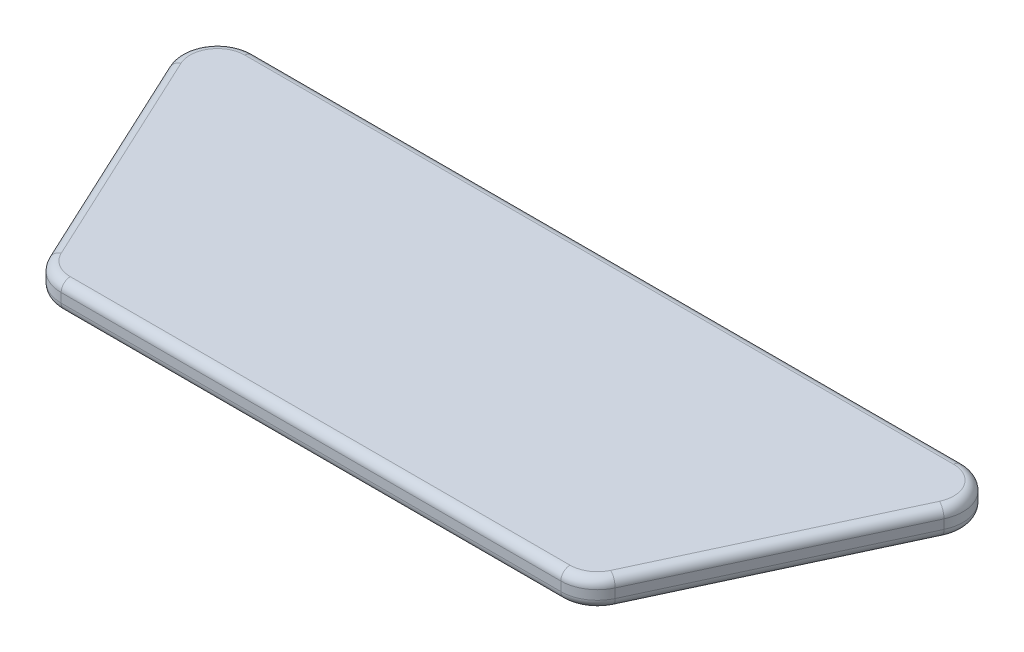
ISO-10303-21;
HEADER;
FILE_DESCRIPTION(('STEP AP214'),'2;1');
FILE_NAME('part.step','',(''),(''),'','','');
FILE_SCHEMA(('AUTOMOTIVE_DESIGN { 1 0 10303 214 1 1 1 1 }'));
ENDSEC;
DATA;
#1=APPLICATION_CONTEXT('core data for automotive mechanical design processes');
#2=APPLICATION_PROTOCOL_DEFINITION('international standard','automotive_design',2000,#1);
#3=PRODUCT_CONTEXT('',#1,'mechanical');
#4=PRODUCT('Part','Part','',(#3));
#5=PRODUCT_RELATED_PRODUCT_CATEGORY('part','',(#4));
#6=PRODUCT_DEFINITION_FORMATION('','',#4);
#7=PRODUCT_DEFINITION_CONTEXT('part definition',#1,'design');
#8=PRODUCT_DEFINITION('design','',#6,#7);
#9=PRODUCT_DEFINITION_SHAPE('','',#8);
#10=(LENGTH_UNIT() NAMED_UNIT(*) SI_UNIT(.MILLI.,.METRE.));
#11=(NAMED_UNIT(*) PLANE_ANGLE_UNIT() SI_UNIT($,.RADIAN.));
#12=(NAMED_UNIT(*) SI_UNIT($,.STERADIAN.) SOLID_ANGLE_UNIT());
#13=UNCERTAINTY_MEASURE_WITH_UNIT(LENGTH_MEASURE(1.E-05),#10,'distance_accuracy_value','');
#14=(GEOMETRIC_REPRESENTATION_CONTEXT(3) GLOBAL_UNCERTAINTY_ASSIGNED_CONTEXT((#13)) GLOBAL_UNIT_ASSIGNED_CONTEXT((#10,
#11,#12)) REPRESENTATION_CONTEXT('',''));
#15=CARTESIAN_POINT('',(0.,0.,0.));
#16=DIRECTION('',(0.,0.,1.));
#17=DIRECTION('',(1.,0.,0.));
#18=AXIS2_PLACEMENT_3D('',#15,#16,#17);
#19=CARTESIAN_POINT('',(261.827991804729,9.525,-4.12755971392547));
#20=DIRECTION('',(0.,-1.,0.));
#21=DIRECTION('',(0.,0.,-1.));
#22=AXIS2_PLACEMENT_3D('',#19,#20,#21);
#23=CYLINDRICAL_SURFACE('',#22,15.24);
#24=DIRECTION('',(0.,-1.,0.));
#25=VECTOR('',#24,1.);
#26=CARTESIAN_POINT('',(275.640122479168,9.525,2.31314259500275));
#27=LINE('',#26,#25);
#28=CARTESIAN_POINT('',(275.640122479168,5.715,2.31314259500275));
#29=VERTEX_POINT('',#28);
#30=CARTESIAN_POINT('',(275.640122479168,1.905,2.31314259500275));
#31=VERTEX_POINT('',#30);
#32=EDGE_CURVE('E240',#29,#31,#27,.T.);
#33=ORIENTED_EDGE('',*,*,#32,.T.);
#34=CARTESIAN_POINT('',(261.827991804729,1.905,-4.12755971392547));
#35=DIRECTION('',(0.,-1.,0.));
#36=DIRECTION('',(0.,0.,-1.));
#37=AXIS2_PLACEMENT_3D('',#34,#35,#36);
#38=CIRCLE('',#37,15.24);
#39=CARTESIAN_POINT('',(261.827991804729,1.905,-19.3675597139255));
#40=VERTEX_POINT('',#39);
#41=EDGE_CURVE('E296',#31,#40,#38,.F.);
#42=ORIENTED_EDGE('',*,*,#41,.T.);
#43=DIRECTION('',(0.,-1.,0.));
#44=VECTOR('',#43,1.);
#45=CARTESIAN_POINT('',(261.827991804729,9.525,-19.3675597139255));
#46=LINE('',#45,#44);
#47=CARTESIAN_POINT('',(261.827991804729,5.715,-19.3675597139255));
#48=VERTEX_POINT('',#47);
#49=EDGE_CURVE('E182',#48,#40,#46,.T.);
#50=ORIENTED_EDGE('',*,*,#49,.F.);
#51=CARTESIAN_POINT('',(261.827991804729,5.715,-4.12755971392547));
#52=DIRECTION('',(0.,-1.,0.));
#53=DIRECTION('',(0.,0.,-1.));
#54=AXIS2_PLACEMENT_3D('',#51,#52,#53);
#55=CIRCLE('',#54,15.24);
#56=EDGE_CURVE('E294',#48,#29,#55,.T.);
#57=ORIENTED_EDGE('',*,*,#56,.T.);
#58=EDGE_LOOP('',(#33,#42,#50,#57));
#59=FACE_BOUND('',#58,.T.);
#60=ADVANCED_FACE('F37',(#59),#23,.T.);
#61=CARTESIAN_POINT('',(-33.2279918047295,9.525,-19.3675597139255));
#62=DIRECTION('',(0.,0.,1.));
#63=DIRECTION('',(1.,0.,0.));
#64=AXIS2_PLACEMENT_3D('',#61,#62,#63);
#65=PLANE('',#64);
#66=ORIENTED_EDGE('',*,*,#49,.T.);
#67=DIRECTION('',(-1.,0.,0.));
#68=VECTOR('',#67,1.);
#69=CARTESIAN_POINT('',(-33.2279918047295,1.905,-19.3675597139255));
#70=LINE('',#69,#68);
#71=CARTESIAN_POINT('',(-33.2279918047295,1.905,-19.3675597139255));
#72=VERTEX_POINT('',#71);
#73=EDGE_CURVE('E292',#40,#72,#70,.T.);
#74=ORIENTED_EDGE('',*,*,#73,.T.);
#75=DIRECTION('',(0.,-1.,0.));
#76=VECTOR('',#75,1.);
#77=CARTESIAN_POINT('',(-33.2279918047295,9.525,-19.3675597139255));
#78=LINE('',#77,#76);
#79=CARTESIAN_POINT('',(-33.2279918047295,5.715,-19.3675597139255));
#80=VERTEX_POINT('',#79);
#81=EDGE_CURVE('E259',#80,#72,#78,.T.);
#82=ORIENTED_EDGE('',*,*,#81,.F.);
#83=DIRECTION('',(-1.,0.,0.));
#84=VECTOR('',#83,1.);
#85=CARTESIAN_POINT('',(-33.2279918047295,5.715,-19.3675597139255));
#86=LINE('',#85,#84);
#87=EDGE_CURVE('E290',#80,#48,#86,.F.);
#88=ORIENTED_EDGE('',*,*,#87,.T.);
#89=EDGE_LOOP('',(#66,#74,#82,#88));
#90=FACE_BOUND('',#89,.T.);
#91=ADVANCED_FACE('F363',(#90),#65,.F.);
#92=CARTESIAN_POINT('',(-33.2279918047295,9.525,-4.12755971392547));
#93=DIRECTION('',(0.,-1.,0.));
#94=DIRECTION('',(0.,0.,-1.));
#95=AXIS2_PLACEMENT_3D('',#92,#93,#94);
#96=CYLINDRICAL_SURFACE('',#95,15.24);
#97=ORIENTED_EDGE('',*,*,#81,.T.);
#98=CARTESIAN_POINT('',(-33.2279918047295,1.905,-4.12755971392547));
#99=DIRECTION('',(0.,-1.,0.));
#100=DIRECTION('',(0.,0.,-1.));
#101=AXIS2_PLACEMENT_3D('',#98,#99,#100);
#102=CIRCLE('',#101,15.24);
#103=CARTESIAN_POINT('',(-47.0401224791681,1.905,2.31314259500276));
#104=VERTEX_POINT('',#103);
#105=EDGE_CURVE('E288',#72,#104,#102,.F.);
#106=ORIENTED_EDGE('',*,*,#105,.T.);
#107=DIRECTION('',(0.,-1.,0.));
#108=VECTOR('',#107,1.);
#109=CARTESIAN_POINT('',(-47.0401224791681,9.525,2.31314259500276));
#110=LINE('',#109,#108);
#111=CARTESIAN_POINT('',(-47.0401224791681,5.715,2.31314259500276));
#112=VERTEX_POINT('',#111);
#113=EDGE_CURVE('E256',#112,#104,#110,.T.);
#114=ORIENTED_EDGE('',*,*,#113,.F.);
#115=CARTESIAN_POINT('',(-33.2279918047295,5.715,-4.12755971392547));
#116=DIRECTION('',(0.,-1.,0.));
#117=DIRECTION('',(0.,0.,-1.));
#118=AXIS2_PLACEMENT_3D('',#115,#116,#117);
#119=CIRCLE('',#118,15.24);
#120=EDGE_CURVE('E286',#112,#80,#119,.T.);
#121=ORIENTED_EDGE('',*,*,#120,.T.);
#122=EDGE_LOOP('',(#97,#106,#114,#121));
#123=FACE_BOUND('',#122,.T.);
#124=ADVANCED_FACE('F339',(#123),#96,.T.);
#125=CARTESIAN_POINT('',(-3.51263412869002,9.525,95.6581425950028));
#126=DIRECTION('',(0.906307787036651,0.,-0.422618261740697));
#127=DIRECTION('',(-0.422618261740697,0.,-0.906307787036651));
#128=AXIS2_PLACEMENT_3D('',#125,#126,#127);
#129=PLANE('',#128);
#130=ORIENTED_EDGE('',*,*,#113,.T.);
#131=DIRECTION('',(0.422618261740697,0.,0.906307787036651));
#132=VECTOR('',#131,1.);
#133=CARTESIAN_POINT('',(-3.51263412869002,1.905,95.6581425950028));
#134=LINE('',#133,#132);
#135=CARTESIAN_POINT('',(-3.51263412869002,1.905,95.6581425950028));
#136=VERTEX_POINT('',#135);
#137=EDGE_CURVE('E284',#104,#136,#134,.T.);
#138=ORIENTED_EDGE('',*,*,#137,.T.);
#139=DIRECTION('',(0.,-1.,0.));
#140=VECTOR('',#139,1.);
#141=CARTESIAN_POINT('',(-3.51263412869002,9.525,95.6581425950028));
#142=LINE('',#141,#140);
#143=CARTESIAN_POINT('',(-3.51263412869002,5.715,95.6581425950028));
#144=VERTEX_POINT('',#143);
#145=EDGE_CURVE('E173',#144,#136,#142,.T.);
#146=ORIENTED_EDGE('',*,*,#145,.F.);
#147=DIRECTION('',(0.422618261740697,0.,0.906307787036651));
#148=VECTOR('',#147,1.);
#149=CARTESIAN_POINT('',(-3.51263412869002,5.715,95.6581425950028));
#150=LINE('',#149,#148);
#151=EDGE_CURVE('E282',#144,#112,#150,.F.);
#152=ORIENTED_EDGE('',*,*,#151,.T.);
#153=EDGE_LOOP('',(#130,#138,#146,#152));
#154=FACE_BOUND('',#153,.T.);
#155=ADVANCED_FACE('F336',(#154),#129,.F.);
#156=CARTESIAN_POINT('',(10.2994965457486,9.525,89.2174402860745));
#157=DIRECTION('',(0.,-1.,0.));
#158=DIRECTION('',(0.,0.,-1.));
#159=AXIS2_PLACEMENT_3D('',#156,#157,#158);
#160=CYLINDRICAL_SURFACE('',#159,15.24);
#161=ORIENTED_EDGE('',*,*,#145,.T.);
#162=CARTESIAN_POINT('',(10.2994965457486,1.905,89.2174402860745));
#163=DIRECTION('',(0.,-1.,0.));
#164=DIRECTION('',(0.,0.,-1.));
#165=AXIS2_PLACEMENT_3D('',#162,#163,#164);
#166=CIRCLE('',#165,15.24);
#167=CARTESIAN_POINT('',(10.2994965457486,1.905,104.457440286075));
#168=VERTEX_POINT('',#167);
#169=EDGE_CURVE('E172',#136,#168,#166,.F.);
#170=ORIENTED_EDGE('',*,*,#169,.T.);
#171=DIRECTION('',(0.,-1.,0.));
#172=VECTOR('',#171,1.);
#173=CARTESIAN_POINT('',(10.2994965457486,9.525,104.457440286075));
#174=LINE('',#173,#172);
#175=CARTESIAN_POINT('',(10.2994965457486,5.715,104.457440286075));
#176=VERTEX_POINT('',#175);
#177=EDGE_CURVE('E154',#176,#168,#174,.T.);
#178=ORIENTED_EDGE('',*,*,#177,.F.);
#179=CARTESIAN_POINT('',(10.2994965457486,5.715,89.2174402860745));
#180=DIRECTION('',(0.,-1.,0.));
#181=DIRECTION('',(0.,0.,-1.));
#182=AXIS2_PLACEMENT_3D('',#179,#180,#181);
#183=CIRCLE('',#182,15.24);
#184=EDGE_CURVE('E169',#176,#144,#183,.T.);
#185=ORIENTED_EDGE('',*,*,#184,.T.);
#186=EDGE_LOOP('',(#161,#170,#178,#185));
#187=FACE_BOUND('',#186,.T.);
#188=ADVANCED_FACE('F168',(#187),#160,.T.);
#189=CARTESIAN_POINT('',(218.300503454251,9.525,104.457440286074));
#190=DIRECTION('',(0.,0.,-1.));
#191=DIRECTION('',(-1.,0.,0.));
#192=AXIS2_PLACEMENT_3D('',#189,#190,#191);
#193=PLANE('',#192);
#194=ORIENTED_EDGE('',*,*,#177,.T.);
#195=DIRECTION('',(1.,0.,0.));
#196=VECTOR('',#195,1.);
#197=CARTESIAN_POINT('',(218.300503454251,1.905,104.457440286074));
#198=LINE('',#197,#196);
#199=CARTESIAN_POINT('',(218.300503454251,1.905,104.457440286074));
#200=VERTEX_POINT('',#199);
#201=EDGE_CURVE('E11',#168,#200,#198,.T.);
#202=ORIENTED_EDGE('',*,*,#201,.T.);
#203=DIRECTION('',(0.,-1.,0.));
#204=VECTOR('',#203,1.);
#205=CARTESIAN_POINT('',(218.300503454251,9.525,104.457440286074));
#206=LINE('',#205,#204);
#207=CARTESIAN_POINT('',(218.300503454251,5.715,104.457440286074));
#208=VERTEX_POINT('',#207);
#209=EDGE_CURVE('E156',#208,#200,#206,.T.);
#210=ORIENTED_EDGE('',*,*,#209,.F.);
#211=DIRECTION('',(1.,0.,0.));
#212=VECTOR('',#211,1.);
#213=CARTESIAN_POINT('',(218.300503454251,5.715,104.457440286074));
#214=LINE('',#213,#212);
#215=EDGE_CURVE('E46',#208,#176,#214,.F.);
#216=ORIENTED_EDGE('',*,*,#215,.T.);
#217=EDGE_LOOP('',(#194,#202,#210,#216));
#218=FACE_BOUND('',#217,.T.);
#219=ADVANCED_FACE('F153',(#218),#193,.F.);
#220=CARTESIAN_POINT('',(218.300503454251,9.525,89.2174402860745));
#221=DIRECTION('',(0.,-1.,0.));
#222=DIRECTION('',(0.,0.,-1.));
#223=AXIS2_PLACEMENT_3D('',#220,#221,#222);
#224=CYLINDRICAL_SURFACE('',#223,15.24);
#225=ORIENTED_EDGE('',*,*,#209,.T.);
#226=CARTESIAN_POINT('',(218.300503454251,1.905,89.2174402860745));
#227=DIRECTION('',(0.,-1.,0.));
#228=DIRECTION('',(0.,0.,-1.));
#229=AXIS2_PLACEMENT_3D('',#226,#227,#228);
#230=CIRCLE('',#229,15.24);
#231=CARTESIAN_POINT('',(232.11263412869,1.905,95.6581425950027));
#232=VERTEX_POINT('',#231);
#233=EDGE_CURVE('E304',#200,#232,#230,.F.);
#234=ORIENTED_EDGE('',*,*,#233,.T.);
#235=DIRECTION('',(0.,-1.,0.));
#236=VECTOR('',#235,1.);
#237=CARTESIAN_POINT('',(232.11263412869,9.525,95.6581425950027));
#238=LINE('',#237,#236);
#239=CARTESIAN_POINT('',(232.11263412869,5.715,95.6581425950027));
#240=VERTEX_POINT('',#239);
#241=EDGE_CURVE('E246',#240,#232,#238,.T.);
#242=ORIENTED_EDGE('',*,*,#241,.F.);
#243=CARTESIAN_POINT('',(218.300503454251,5.715,89.2174402860745));
#244=DIRECTION('',(0.,-1.,0.));
#245=DIRECTION('',(0.,0.,-1.));
#246=AXIS2_PLACEMENT_3D('',#243,#244,#245);
#247=CIRCLE('',#246,15.24);
#248=EDGE_CURVE('E302',#240,#208,#247,.T.);
#249=ORIENTED_EDGE('',*,*,#248,.T.);
#250=EDGE_LOOP('',(#225,#234,#242,#249));
#251=FACE_BOUND('',#250,.T.);
#252=ADVANCED_FACE('F378',(#251),#224,.T.);
#253=CARTESIAN_POINT('',(275.640122479168,9.525,2.31314259500275));
#254=DIRECTION('',(-0.906307787036651,0.,-0.422618261740697));
#255=DIRECTION('',(-0.422618261740697,0.,0.906307787036651));
#256=AXIS2_PLACEMENT_3D('',#253,#254,#255);
#257=PLANE('',#256);
#258=ORIENTED_EDGE('',*,*,#241,.T.);
#259=DIRECTION('',(0.422618261740697,0.,-0.906307787036651));
#260=VECTOR('',#259,1.);
#261=CARTESIAN_POINT('',(275.640122479168,1.905,2.31314259500275));
#262=LINE('',#261,#260);
#263=EDGE_CURVE('E300',#232,#31,#262,.T.);
#264=ORIENTED_EDGE('',*,*,#263,.T.);
#265=ORIENTED_EDGE('',*,*,#32,.F.);
#266=DIRECTION('',(0.422618261740697,0.,-0.906307787036651));
#267=VECTOR('',#266,1.);
#268=CARTESIAN_POINT('',(275.640122479168,5.715,2.31314259500275));
#269=LINE('',#268,#267);
#270=EDGE_CURVE('E298',#29,#240,#269,.F.);
#271=ORIENTED_EDGE('',*,*,#270,.T.);
#272=EDGE_LOOP('',(#258,#264,#265,#271));
#273=FACE_BOUND('',#272,.T.);
#274=ADVANCED_FACE('F381',(#273),#257,.F.);
#275=CARTESIAN_POINT('',(261.827991804729,9.525,-4.12755971392547));
#276=DIRECTION('',(0.,-1.,0.));
#277=DIRECTION('',(0.,0.,-1.));
#278=AXIS2_PLACEMENT_3D('',#275,#276,#277);
#279=PLANE('',#278);
#280=DIRECTION('',(0.422618261740697,0.,0.906307787036651));
#281=VECTOR('',#280,1.);
#282=CARTESIAN_POINT('',(9.11173678015309,9.525,113.715965344285));
#283=LINE('',#282,#281);
#284=CARTESIAN_POINT('',(-43.5870898105584,9.525,0.702967017770699));
#285=VERTEX_POINT('',#284);
#286=CARTESIAN_POINT('',(-0.0596014600803378,9.525,94.0479670177707));
#287=VERTEX_POINT('',#286);
#288=EDGE_CURVE('E54',#285,#287,#283,.T.);
#289=ORIENTED_EDGE('',*,*,#288,.T.);
#290=CARTESIAN_POINT('',(10.2994965457486,9.525,89.2174402860745));
#291=DIRECTION('',(0.,-1.,0.));
#292=DIRECTION('',(0.,0.,-1.));
#293=AXIS2_PLACEMENT_3D('',#290,#291,#292);
#294=CIRCLE('',#293,11.43);
#295=CARTESIAN_POINT('',(10.2994965457486,9.525,100.647440286075));
#296=VERTEX_POINT('',#295);
#297=EDGE_CURVE('E161',#287,#296,#294,.F.);
#298=ORIENTED_EDGE('',*,*,#297,.T.);
#299=DIRECTION('',(1.,0.,0.));
#300=VECTOR('',#299,1.);
#301=CARTESIAN_POINT('',(261.82799180473,9.525,100.647440286074));
#302=LINE('',#301,#300);
#303=CARTESIAN_POINT('',(218.300503454251,9.525,100.647440286074));
#304=VERTEX_POINT('',#303);
#305=EDGE_CURVE('E185',#296,#304,#302,.T.);
#306=ORIENTED_EDGE('',*,*,#305,.T.);
#307=CARTESIAN_POINT('',(218.300503454251,9.525,89.2174402860745));
#308=DIRECTION('',(0.,-1.,0.));
#309=DIRECTION('',(0.,0.,-1.));
#310=AXIS2_PLACEMENT_3D('',#307,#308,#309);
#311=CIRCLE('',#310,11.43);
#312=CARTESIAN_POINT('',(228.65960146008,9.525,94.0479670177707));
#313=VERTEX_POINT('',#312);
#314=EDGE_CURVE('E307',#304,#313,#311,.F.);
#315=ORIENTED_EDGE('',*,*,#314,.T.);
#316=DIRECTION('',(0.422618261740697,0.,-0.906307787036651));
#317=VECTOR('',#316,1.);
#318=CARTESIAN_POINT('',(272.187089810558,9.525,0.702967017770681));
#319=LINE('',#318,#317);
#320=CARTESIAN_POINT('',(272.187089810558,9.525,0.702967017770689));
#321=VERTEX_POINT('',#320);
#322=EDGE_CURVE('E309',#313,#321,#319,.T.);
#323=ORIENTED_EDGE('',*,*,#322,.T.);
#324=CARTESIAN_POINT('',(261.827991804729,9.525,-4.12755971392547));
#325=DIRECTION('',(0.,-1.,0.));
#326=DIRECTION('',(0.,0.,-1.));
#327=AXIS2_PLACEMENT_3D('',#324,#325,#326);
#328=CIRCLE('',#327,11.43);
#329=CARTESIAN_POINT('',(261.827991804729,9.525,-15.5575597139254));
#330=VERTEX_POINT('',#329);
#331=EDGE_CURVE('E311',#321,#330,#328,.F.);
#332=ORIENTED_EDGE('',*,*,#331,.T.);
#333=DIRECTION('',(-1.,0.,0.));
#334=VECTOR('',#333,1.);
#335=CARTESIAN_POINT('',(261.827991804729,9.525,-15.5575597139255));
#336=LINE('',#335,#334);
#337=CARTESIAN_POINT('',(-33.2279918047295,9.525,-15.5575597139255));
#338=VERTEX_POINT('',#337);
#339=EDGE_CURVE('E313',#330,#338,#336,.T.);
#340=ORIENTED_EDGE('',*,*,#339,.T.);
#341=CARTESIAN_POINT('',(-33.2279918047295,9.525,-4.12755971392547));
#342=DIRECTION('',(0.,-1.,0.));
#343=DIRECTION('',(0.,0.,-1.));
#344=AXIS2_PLACEMENT_3D('',#341,#342,#343);
#345=CIRCLE('',#344,11.43);
#346=EDGE_CURVE('E59',#338,#285,#345,.F.);
#347=ORIENTED_EDGE('',*,*,#346,.T.);
#348=EDGE_LOOP('',(#289,#298,#306,#315,#323,#332,#340,#347));
#349=FACE_BOUND('',#348,.T.);
#350=ADVANCED_FACE('F317',(#349),#279,.F.);
#351=CARTESIAN_POINT('',(261.827991804729,-1.905,-4.12755971392547));
#352=DIRECTION('',(0.,-1.,0.));
#353=DIRECTION('',(0.,0.,-1.));
#354=AXIS2_PLACEMENT_3D('',#351,#352,#353);
#355=PLANE('',#354);
#356=DIRECTION('',(1.,0.,0.));
#357=VECTOR('',#356,1.);
#358=CARTESIAN_POINT('',(10.2994965457486,-1.905,100.647440286075));
#359=LINE('',#358,#357);
#360=CARTESIAN_POINT('',(218.300503454251,-1.905,100.647440286074));
#361=VERTEX_POINT('',#360);
#362=CARTESIAN_POINT('',(10.2994965457486,-1.905,100.647440286075));
#363=VERTEX_POINT('',#362);
#364=EDGE_CURVE('E265',#361,#363,#359,.F.);
#365=ORIENTED_EDGE('',*,*,#364,.T.);
#366=CARTESIAN_POINT('',(10.2994965457486,-1.905,89.2174402860745));
#367=DIRECTION('',(0.,-1.,0.));
#368=DIRECTION('',(0.,0.,-1.));
#369=AXIS2_PLACEMENT_3D('',#366,#367,#368);
#370=CIRCLE('',#369,11.43);
#371=CARTESIAN_POINT('',(-0.0596014600803794,-1.905,94.0479670177707));
#372=VERTEX_POINT('',#371);
#373=EDGE_CURVE('E279',#363,#372,#370,.T.);
#374=ORIENTED_EDGE('',*,*,#373,.T.);
#375=DIRECTION('',(0.422618261740697,0.,0.906307787036651));
#376=VECTOR('',#375,1.);
#377=CARTESIAN_POINT('',(-43.5870898105584,-1.905,0.702967017770702));
#378=LINE('',#377,#376);
#379=CARTESIAN_POINT('',(-43.5870898105584,-1.905,0.702967017770697));
#380=VERTEX_POINT('',#379);
#381=EDGE_CURVE('E277',#372,#380,#378,.F.);
#382=ORIENTED_EDGE('',*,*,#381,.T.);
#383=CARTESIAN_POINT('',(-33.2279918047295,-1.905,-4.12755971392547));
#384=DIRECTION('',(0.,-1.,0.));
#385=DIRECTION('',(0.,0.,-1.));
#386=AXIS2_PLACEMENT_3D('',#383,#384,#385);
#387=CIRCLE('',#386,11.43);
#388=CARTESIAN_POINT('',(-33.2279918047295,-1.905,-15.5575597139255));
#389=VERTEX_POINT('',#388);
#390=EDGE_CURVE('E275',#380,#389,#387,.T.);
#391=ORIENTED_EDGE('',*,*,#390,.T.);
#392=DIRECTION('',(-1.,0.,0.));
#393=VECTOR('',#392,1.);
#394=CARTESIAN_POINT('',(261.827991804729,-1.905,-15.5575597139255));
#395=LINE('',#394,#393);
#396=CARTESIAN_POINT('',(261.827991804729,-1.905,-15.5575597139254));
#397=VERTEX_POINT('',#396);
#398=EDGE_CURVE('E273',#389,#397,#395,.F.);
#399=ORIENTED_EDGE('',*,*,#398,.T.);
#400=CARTESIAN_POINT('',(261.827991804729,-1.905,-4.12755971392547));
#401=DIRECTION('',(0.,-1.,0.));
#402=DIRECTION('',(0.,0.,-1.));
#403=AXIS2_PLACEMENT_3D('',#400,#401,#402);
#404=CIRCLE('',#403,11.43);
#405=CARTESIAN_POINT('',(272.187089810558,-1.905,0.702967017770684));
#406=VERTEX_POINT('',#405);
#407=EDGE_CURVE('E271',#397,#406,#404,.T.);
#408=ORIENTED_EDGE('',*,*,#407,.T.);
#409=DIRECTION('',(0.422618261740697,0.,-0.906307787036651));
#410=VECTOR('',#409,1.);
#411=CARTESIAN_POINT('',(228.65960146008,-1.905,94.0479670177707));
#412=LINE('',#411,#410);
#413=CARTESIAN_POINT('',(228.65960146008,-1.905,94.0479670177707));
#414=VERTEX_POINT('',#413);
#415=EDGE_CURVE('E269',#406,#414,#412,.F.);
#416=ORIENTED_EDGE('',*,*,#415,.T.);
#417=CARTESIAN_POINT('',(218.300503454251,-1.905,89.2174402860745));
#418=DIRECTION('',(0.,-1.,0.));
#419=DIRECTION('',(0.,0.,-1.));
#420=AXIS2_PLACEMENT_3D('',#417,#418,#419);
#421=CIRCLE('',#420,11.43);
#422=EDGE_CURVE('E267',#414,#361,#421,.T.);
#423=ORIENTED_EDGE('',*,*,#422,.T.);
#424=EDGE_LOOP('',(#365,#374,#382,#391,#399,#408,#416,#423));
#425=FACE_BOUND('',#424,.T.);
#426=ADVANCED_FACE('F386',(#425),#355,.T.);
#427=CARTESIAN_POINT('',(261.827991804729,1.905,-4.12755971392547));
#428=DIRECTION('',(0.,-1.,0.));
#429=DIRECTION('',(0.,0.,-1.));
#430=AXIS2_PLACEMENT_3D('',#427,#428,#429);
#431=TOROIDAL_SURFACE('',#430,11.43,3.81);
#432=CARTESIAN_POINT('',(272.187089810558,1.905,0.702967017770702));
#433=DIRECTION('',(-0.422618261740697,0.,0.906307787036651));
#434=DIRECTION('',(0.906307787036651,0.,0.422618261740697));
#435=AXIS2_PLACEMENT_3D('',#432,#433,#434);
#436=CIRCLE('',#435,3.81);
#437=EDGE_CURVE('E233',#406,#31,#436,.T.);
#438=ORIENTED_EDGE('',*,*,#437,.F.);
#439=ORIENTED_EDGE('',*,*,#407,.F.);
#440=CARTESIAN_POINT('',(261.827991804729,1.905,-15.5575597139254));
#441=DIRECTION('',(-1.,0.,0.));
#442=DIRECTION('',(0.,0.,1.));
#443=AXIS2_PLACEMENT_3D('',#440,#441,#442);
#444=CIRCLE('',#443,3.81);
#445=EDGE_CURVE('E190',#40,#397,#444,.T.);
#446=ORIENTED_EDGE('',*,*,#445,.F.);
#447=ORIENTED_EDGE('',*,*,#41,.F.);
#448=EDGE_LOOP('',(#438,#439,#446,#447));
#449=FACE_BOUND('',#448,.T.);
#450=ADVANCED_FACE('F389',(#449),#431,.T.);
#451=CARTESIAN_POINT('',(-33.2279918047295,1.905,-15.5575597139255));
#452=DIRECTION('',(1.,0.,0.));
#453=DIRECTION('',(0.,0.,-1.));
#454=AXIS2_PLACEMENT_3D('',#451,#452,#453);
#455=CYLINDRICAL_SURFACE('',#454,3.81);
#456=ORIENTED_EDGE('',*,*,#445,.T.);
#457=ORIENTED_EDGE('',*,*,#398,.F.);
#458=CARTESIAN_POINT('',(-33.2279918047295,1.905,-15.5575597139255));
#459=DIRECTION('',(-1.,0.,0.));
#460=DIRECTION('',(0.,0.,1.));
#461=AXIS2_PLACEMENT_3D('',#458,#459,#460);
#462=CIRCLE('',#461,3.81);
#463=EDGE_CURVE('E231',#72,#389,#462,.T.);
#464=ORIENTED_EDGE('',*,*,#463,.F.);
#465=ORIENTED_EDGE('',*,*,#73,.F.);
#466=EDGE_LOOP('',(#456,#457,#464,#465));
#467=FACE_BOUND('',#466,.T.);
#468=ADVANCED_FACE('F406',(#467),#455,.T.);
#469=CARTESIAN_POINT('',(272.187089810558,1.905,0.702967017770694));
#470=DIRECTION('',(-0.422618261740697,0.,0.906307787036651));
#471=DIRECTION('',(0.906307787036651,0.,0.422618261740697));
#472=AXIS2_PLACEMENT_3D('',#469,#470,#471);
#473=CYLINDRICAL_SURFACE('',#472,3.81);
#474=ORIENTED_EDGE('',*,*,#437,.T.);
#475=ORIENTED_EDGE('',*,*,#263,.F.);
#476=CARTESIAN_POINT('',(228.65960146008,1.905,94.0479670177707));
#477=DIRECTION('',(-0.422618261740697,0.,0.906307787036651));
#478=DIRECTION('',(0.906307787036651,0.,0.422618261740697));
#479=AXIS2_PLACEMENT_3D('',#476,#477,#478);
#480=CIRCLE('',#479,3.81);
#481=EDGE_CURVE('E228',#414,#232,#480,.T.);
#482=ORIENTED_EDGE('',*,*,#481,.F.);
#483=ORIENTED_EDGE('',*,*,#415,.F.);
#484=EDGE_LOOP('',(#474,#475,#482,#483));
#485=FACE_BOUND('',#484,.T.);
#486=ADVANCED_FACE('F414',(#485),#473,.T.);
#487=CARTESIAN_POINT('',(-33.2279918047295,1.905,-4.12755971392547));
#488=DIRECTION('',(0.,-1.,0.));
#489=DIRECTION('',(0.,0.,-1.));
#490=AXIS2_PLACEMENT_3D('',#487,#488,#489);
#491=TOROIDAL_SURFACE('',#490,11.43,3.81);
#492=ORIENTED_EDGE('',*,*,#463,.T.);
#493=ORIENTED_EDGE('',*,*,#390,.F.);
#494=CARTESIAN_POINT('',(-43.5870898105584,1.905,0.702967017770699));
#495=DIRECTION('',(0.422618261740697,0.,0.906307787036651));
#496=DIRECTION('',(0.906307787036651,0.,-0.422618261740697));
#497=AXIS2_PLACEMENT_3D('',#494,#495,#496);
#498=CIRCLE('',#497,3.81);
#499=EDGE_CURVE('E225',#104,#380,#498,.T.);
#500=ORIENTED_EDGE('',*,*,#499,.F.);
#501=ORIENTED_EDGE('',*,*,#105,.F.);
#502=EDGE_LOOP('',(#492,#493,#500,#501));
#503=FACE_BOUND('',#502,.T.);
#504=ADVANCED_FACE('F344',(#503),#491,.T.);
#505=CARTESIAN_POINT('',(218.300503454251,1.905,89.2174402860745));
#506=DIRECTION('',(0.,-1.,0.));
#507=DIRECTION('',(0.,0.,-1.));
#508=AXIS2_PLACEMENT_3D('',#505,#506,#507);
#509=TOROIDAL_SURFACE('',#508,11.43,3.81);
#510=ORIENTED_EDGE('',*,*,#481,.T.);
#511=ORIENTED_EDGE('',*,*,#233,.F.);
#512=CARTESIAN_POINT('',(218.300503454251,1.905,100.647440286074));
#513=DIRECTION('',(-1.,0.,0.));
#514=DIRECTION('',(0.,0.,1.));
#515=AXIS2_PLACEMENT_3D('',#512,#513,#514);
#516=CIRCLE('',#515,3.81);
#517=EDGE_CURVE('E220',#361,#200,#516,.T.);
#518=ORIENTED_EDGE('',*,*,#517,.F.);
#519=ORIENTED_EDGE('',*,*,#422,.F.);
#520=EDGE_LOOP('',(#510,#511,#518,#519));
#521=FACE_BOUND('',#520,.T.);
#522=ADVANCED_FACE('F427',(#521),#509,.T.);
#523=CARTESIAN_POINT('',(-0.0596014600803794,1.905,94.0479670177707));
#524=DIRECTION('',(-0.422618261740697,0.,-0.906307787036651));
#525=DIRECTION('',(-0.906307787036651,0.,0.422618261740697));
#526=AXIS2_PLACEMENT_3D('',#523,#524,#525);
#527=CYLINDRICAL_SURFACE('',#526,3.81);
#528=ORIENTED_EDGE('',*,*,#499,.T.);
#529=ORIENTED_EDGE('',*,*,#381,.F.);
#530=CARTESIAN_POINT('',(-0.0596014600803794,1.905,94.0479670177707));
#531=DIRECTION('',(0.422618261740698,0.,0.906307787036651));
#532=DIRECTION('',(0.906307787036651,0.,-0.422618261740698));
#533=AXIS2_PLACEMENT_3D('',#530,#531,#532);
#534=CIRCLE('',#533,3.81);
#535=EDGE_CURVE('E214',#136,#372,#534,.T.);
#536=ORIENTED_EDGE('',*,*,#535,.F.);
#537=ORIENTED_EDGE('',*,*,#137,.F.);
#538=EDGE_LOOP('',(#528,#529,#536,#537));
#539=FACE_BOUND('',#538,.T.);
#540=ADVANCED_FACE('F350',(#539),#527,.T.);
#541=CARTESIAN_POINT('',(218.300503454251,1.905,100.647440286074));
#542=DIRECTION('',(-1.,0.,0.));
#543=DIRECTION('',(0.,0.,1.));
#544=AXIS2_PLACEMENT_3D('',#541,#542,#543);
#545=CYLINDRICAL_SURFACE('',#544,3.81);
#546=ORIENTED_EDGE('',*,*,#517,.T.);
#547=ORIENTED_EDGE('',*,*,#201,.F.);
#548=CARTESIAN_POINT('',(10.2994965457486,1.905,100.647440286075));
#549=DIRECTION('',(-1.,0.,0.));
#550=DIRECTION('',(0.,0.,1.));
#551=AXIS2_PLACEMENT_3D('',#548,#549,#550);
#552=CIRCLE('',#551,3.81);
#553=EDGE_CURVE('E209',#363,#168,#552,.T.);
#554=ORIENTED_EDGE('',*,*,#553,.F.);
#555=ORIENTED_EDGE('',*,*,#364,.F.);
#556=EDGE_LOOP('',(#546,#547,#554,#555));
#557=FACE_BOUND('',#556,.T.);
#558=ADVANCED_FACE('F353',(#557),#545,.T.);
#559=CARTESIAN_POINT('',(10.2994965457486,1.905,89.2174402860745));
#560=DIRECTION('',(0.,-1.,0.));
#561=DIRECTION('',(0.,0.,-1.));
#562=AXIS2_PLACEMENT_3D('',#559,#560,#561);
#563=TOROIDAL_SURFACE('',#562,11.43,3.81);
#564=ORIENTED_EDGE('',*,*,#535,.T.);
#565=ORIENTED_EDGE('',*,*,#373,.F.);
#566=ORIENTED_EDGE('',*,*,#553,.T.);
#567=ORIENTED_EDGE('',*,*,#169,.F.);
#568=EDGE_LOOP('',(#564,#565,#566,#567));
#569=FACE_BOUND('',#568,.T.);
#570=ADVANCED_FACE('F351',(#569),#563,.T.);
#571=CARTESIAN_POINT('',(261.827991804729,5.715,-4.12755971392547));
#572=DIRECTION('',(0.,-1.,0.));
#573=DIRECTION('',(0.,0.,-1.));
#574=AXIS2_PLACEMENT_3D('',#571,#572,#573);
#575=TOROIDAL_SURFACE('',#574,11.43,3.81);
#576=CARTESIAN_POINT('',(272.187089810558,5.715,0.702967017770705));
#577=DIRECTION('',(-0.422618261740696,0.,0.906307787036651));
#578=DIRECTION('',(0.906307787036651,0.,0.422618261740696));
#579=AXIS2_PLACEMENT_3D('',#576,#577,#578);
#580=CIRCLE('',#579,3.81);
#581=EDGE_CURVE('E202',#29,#321,#580,.T.);
#582=ORIENTED_EDGE('',*,*,#581,.F.);
#583=ORIENTED_EDGE('',*,*,#56,.F.);
#584=CARTESIAN_POINT('',(261.827991804729,5.715,-15.5575597139254));
#585=DIRECTION('',(-1.,0.,0.));
#586=DIRECTION('',(0.,0.,1.));
#587=AXIS2_PLACEMENT_3D('',#584,#585,#586);
#588=CIRCLE('',#587,3.81);
#589=EDGE_CURVE('E41',#330,#48,#588,.T.);
#590=ORIENTED_EDGE('',*,*,#589,.F.);
#591=ORIENTED_EDGE('',*,*,#331,.F.);
#592=EDGE_LOOP('',(#582,#583,#590,#591));
#593=FACE_BOUND('',#592,.T.);
#594=ADVANCED_FACE('F39',(#593),#575,.T.);
#595=CARTESIAN_POINT('',(261.827991804729,5.715,-15.5575597139255));
#596=DIRECTION('',(-1.,0.,0.));
#597=DIRECTION('',(0.,0.,1.));
#598=AXIS2_PLACEMENT_3D('',#595,#596,#597);
#599=CYLINDRICAL_SURFACE('',#598,3.81);
#600=ORIENTED_EDGE('',*,*,#589,.T.);
#601=ORIENTED_EDGE('',*,*,#87,.F.);
#602=CARTESIAN_POINT('',(-33.2279918047295,5.715,-15.5575597139255));
#603=DIRECTION('',(-1.,0.,0.));
#604=DIRECTION('',(0.,0.,1.));
#605=AXIS2_PLACEMENT_3D('',#602,#603,#604);
#606=CIRCLE('',#605,3.81);
#607=EDGE_CURVE('E200',#338,#80,#606,.T.);
#608=ORIENTED_EDGE('',*,*,#607,.F.);
#609=ORIENTED_EDGE('',*,*,#339,.F.);
#610=EDGE_LOOP('',(#600,#601,#608,#609));
#611=FACE_BOUND('',#610,.T.);
#612=ADVANCED_FACE('F328',(#611),#599,.T.);
#613=CARTESIAN_POINT('',(272.187089810558,5.715,0.702967017770681));
#614=DIRECTION('',(0.422618261740697,0.,-0.906307787036651));
#615=DIRECTION('',(-0.906307787036651,0.,-0.422618261740697));
#616=AXIS2_PLACEMENT_3D('',#613,#614,#615);
#617=CYLINDRICAL_SURFACE('',#616,3.81);
#618=ORIENTED_EDGE('',*,*,#581,.T.);
#619=ORIENTED_EDGE('',*,*,#322,.F.);
#620=CARTESIAN_POINT('',(228.65960146008,5.715,94.0479670177707));
#621=DIRECTION('',(-0.422618261740697,0.,0.906307787036651));
#622=DIRECTION('',(0.906307787036651,0.,0.422618261740697));
#623=AXIS2_PLACEMENT_3D('',#620,#621,#622);
#624=CIRCLE('',#623,3.81);
#625=EDGE_CURVE('E197',#240,#313,#624,.T.);
#626=ORIENTED_EDGE('',*,*,#625,.F.);
#627=ORIENTED_EDGE('',*,*,#270,.F.);
#628=EDGE_LOOP('',(#618,#619,#626,#627));
#629=FACE_BOUND('',#628,.T.);
#630=ADVANCED_FACE('F323',(#629),#617,.T.);
#631=CARTESIAN_POINT('',(-33.2279918047295,5.715,-4.12755971392547));
#632=DIRECTION('',(0.,-1.,0.));
#633=DIRECTION('',(0.,0.,-1.));
#634=AXIS2_PLACEMENT_3D('',#631,#632,#633);
#635=TOROIDAL_SURFACE('',#634,11.43,3.81);
#636=ORIENTED_EDGE('',*,*,#607,.T.);
#637=ORIENTED_EDGE('',*,*,#120,.F.);
#638=CARTESIAN_POINT('',(-43.5870898105584,5.715,0.702967017770699));
#639=DIRECTION('',(0.422618261740697,0.,0.906307787036651));
#640=DIRECTION('',(0.906307787036651,0.,-0.422618261740697));
#641=AXIS2_PLACEMENT_3D('',#638,#639,#640);
#642=CIRCLE('',#641,3.81);
#643=EDGE_CURVE('E194',#285,#112,#642,.T.);
#644=ORIENTED_EDGE('',*,*,#643,.F.);
#645=ORIENTED_EDGE('',*,*,#346,.F.);
#646=EDGE_LOOP('',(#636,#637,#644,#645));
#647=FACE_BOUND('',#646,.T.);
#648=ADVANCED_FACE('F331',(#647),#635,.T.);
#649=CARTESIAN_POINT('',(218.300503454251,5.715,89.2174402860745));
#650=DIRECTION('',(0.,-1.,0.));
#651=DIRECTION('',(0.,0.,-1.));
#652=AXIS2_PLACEMENT_3D('',#649,#650,#651);
#653=TOROIDAL_SURFACE('',#652,11.43,3.81);
#654=ORIENTED_EDGE('',*,*,#625,.T.);
#655=ORIENTED_EDGE('',*,*,#314,.F.);
#656=CARTESIAN_POINT('',(218.300503454251,5.715,100.647440286074));
#657=DIRECTION('',(-1.,0.,0.));
#658=DIRECTION('',(0.,0.,1.));
#659=AXIS2_PLACEMENT_3D('',#656,#657,#658);
#660=CIRCLE('',#659,3.81);
#661=EDGE_CURVE('E187',#208,#304,#660,.T.);
#662=ORIENTED_EDGE('',*,*,#661,.F.);
#663=ORIENTED_EDGE('',*,*,#248,.F.);
#664=EDGE_LOOP('',(#654,#655,#662,#663));
#665=FACE_BOUND('',#664,.T.);
#666=ADVANCED_FACE('F320',(#665),#653,.T.);
#667=CARTESIAN_POINT('',(9.11173678015309,5.715,113.715965344285));
#668=DIRECTION('',(0.422618261740697,0.,0.906307787036651));
#669=DIRECTION('',(0.906307787036651,0.,-0.422618261740697));
#670=AXIS2_PLACEMENT_3D('',#667,#668,#669);
#671=CYLINDRICAL_SURFACE('',#670,3.81);
#672=ORIENTED_EDGE('',*,*,#643,.T.);
#673=ORIENTED_EDGE('',*,*,#151,.F.);
#674=CARTESIAN_POINT('',(-0.0596014600803378,5.715,94.0479670177707));
#675=DIRECTION('',(0.422618261740698,0.,0.90630778703665));
#676=DIRECTION('',(0.90630778703665,0.,-0.422618261740698));
#677=AXIS2_PLACEMENT_3D('',#674,#675,#676);
#678=CIRCLE('',#677,3.81);
#679=EDGE_CURVE('E180',#287,#144,#678,.T.);
#680=ORIENTED_EDGE('',*,*,#679,.F.);
#681=ORIENTED_EDGE('',*,*,#288,.F.);
#682=EDGE_LOOP('',(#672,#673,#680,#681));
#683=FACE_BOUND('',#682,.T.);
#684=ADVANCED_FACE('F333',(#683),#671,.T.);
#685=CARTESIAN_POINT('',(261.82799180473,5.715,100.647440286074));
#686=DIRECTION('',(1.,0.,0.));
#687=DIRECTION('',(0.,0.,-1.));
#688=AXIS2_PLACEMENT_3D('',#685,#686,#687);
#689=CYLINDRICAL_SURFACE('',#688,3.81);
#690=ORIENTED_EDGE('',*,*,#661,.T.);
#691=ORIENTED_EDGE('',*,*,#305,.F.);
#692=CARTESIAN_POINT('',(10.2994965457486,5.715,100.647440286075));
#693=DIRECTION('',(-1.,0.,0.));
#694=DIRECTION('',(0.,0.,1.));
#695=AXIS2_PLACEMENT_3D('',#692,#693,#694);
#696=CIRCLE('',#695,3.81);
#697=EDGE_CURVE('E178',#176,#296,#696,.T.);
#698=ORIENTED_EDGE('',*,*,#697,.F.);
#699=ORIENTED_EDGE('',*,*,#215,.F.);
#700=EDGE_LOOP('',(#690,#691,#698,#699));
#701=FACE_BOUND('',#700,.T.);
#702=ADVANCED_FACE('F184',(#701),#689,.T.);
#703=CARTESIAN_POINT('',(10.2994965457486,5.715,89.2174402860745));
#704=DIRECTION('',(0.,-1.,0.));
#705=DIRECTION('',(0.,0.,-1.));
#706=AXIS2_PLACEMENT_3D('',#703,#704,#705);
#707=TOROIDAL_SURFACE('',#706,11.43,3.81);
#708=ORIENTED_EDGE('',*,*,#679,.T.);
#709=ORIENTED_EDGE('',*,*,#184,.F.);
#710=ORIENTED_EDGE('',*,*,#697,.T.);
#711=ORIENTED_EDGE('',*,*,#297,.F.);
#712=EDGE_LOOP('',(#708,#709,#710,#711));
#713=FACE_BOUND('',#712,.T.);
#714=ADVANCED_FACE('F176',(#713),#707,.T.);
#715=CLOSED_SHELL('',(#60,#91,#124,#155,#188,#219,#252,#274,#350,#426,#450,#468,#486,#504,#522,
#540,#558,#570,#594,#612,#630,#648,#666,#684,#702,#714));
#716=MANIFOLD_SOLID_BREP('B2',#715);
#717=ADVANCED_BREP_SHAPE_REPRESENTATION('',(#18,#716),#14);
#718=SHAPE_DEFINITION_REPRESENTATION(#9,#717);
ENDSEC;
END-ISO-10303-21;
